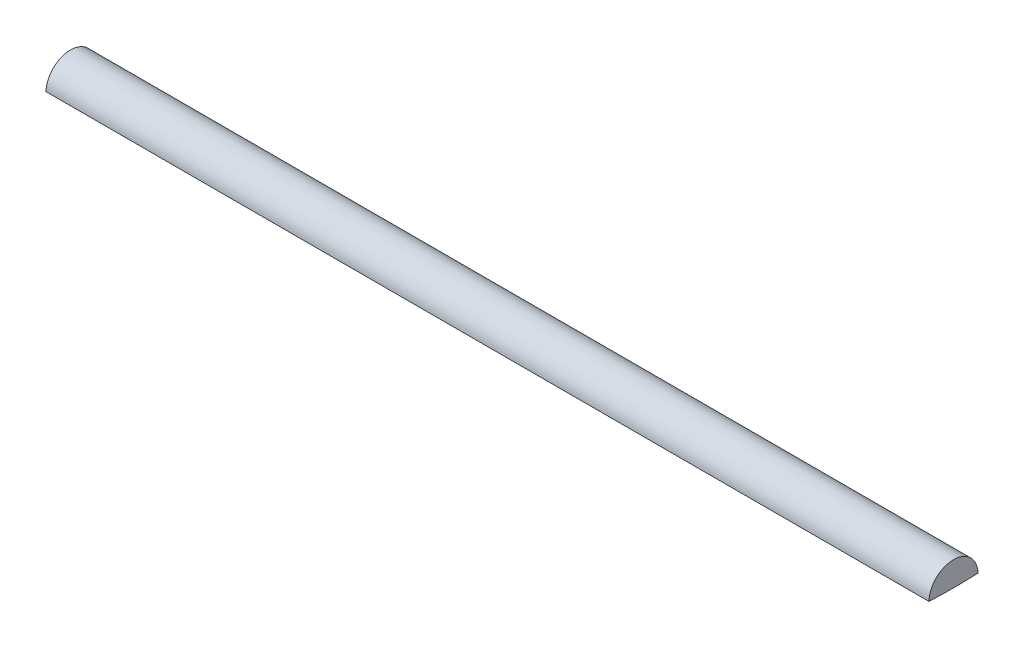
ISO-10303-21;
HEADER;
FILE_DESCRIPTION(('STEP AP214'),'2;1');
FILE_NAME('part.step','',(''),(''),'','','');
FILE_SCHEMA(('AUTOMOTIVE_DESIGN { 1 0 10303 214 1 1 1 1 }'));
ENDSEC;
DATA;
#1=APPLICATION_CONTEXT('core data for automotive mechanical design processes');
#2=APPLICATION_PROTOCOL_DEFINITION('international standard','automotive_design',2000,#1);
#3=PRODUCT_CONTEXT('',#1,'mechanical');
#4=PRODUCT('Part','Part','',(#3));
#5=PRODUCT_RELATED_PRODUCT_CATEGORY('part','',(#4));
#6=PRODUCT_DEFINITION_FORMATION('','',#4);
#7=PRODUCT_DEFINITION_CONTEXT('part definition',#1,'design');
#8=PRODUCT_DEFINITION('design','',#6,#7);
#9=PRODUCT_DEFINITION_SHAPE('','',#8);
#10=(LENGTH_UNIT() NAMED_UNIT(*) SI_UNIT(.MILLI.,.METRE.));
#11=(NAMED_UNIT(*) PLANE_ANGLE_UNIT() SI_UNIT($,.RADIAN.));
#12=(NAMED_UNIT(*) SI_UNIT($,.STERADIAN.) SOLID_ANGLE_UNIT());
#13=UNCERTAINTY_MEASURE_WITH_UNIT(LENGTH_MEASURE(1.E-05),#10,'distance_accuracy_value','');
#14=(GEOMETRIC_REPRESENTATION_CONTEXT(3) GLOBAL_UNCERTAINTY_ASSIGNED_CONTEXT((#13)) GLOBAL_UNIT_ASSIGNED_CONTEXT((#10,
#11,#12)) REPRESENTATION_CONTEXT('',''));
#15=CARTESIAN_POINT('',(0.,0.,0.));
#16=DIRECTION('',(0.,0.,1.));
#17=DIRECTION('',(1.,0.,0.));
#18=AXIS2_PLACEMENT_3D('',#15,#16,#17);
#19=CARTESIAN_POINT('',(114.3,-63.5,0.));
#20=DIRECTION('',(-1.,0.,0.));
#21=DIRECTION('',(0.,0.,1.));
#22=AXIS2_PLACEMENT_3D('',#19,#20,#21);
#23=CYLINDRICAL_SURFACE('',#22,3.17500000000022);
#24=CARTESIAN_POINT('',(0.,-63.5,0.));
#25=DIRECTION('',(1.,0.,0.));
#26=DIRECTION('',(0.,0.,-1.));
#27=AXIS2_PLACEMENT_3D('',#24,#25,#26);
#28=CIRCLE('',#27,3.17500000000022);
#29=CARTESIAN_POINT('',(0.,-63.420625,-3.17400765742244));
#30=VERTEX_POINT('',#29);
#31=CARTESIAN_POINT('',(0.,-63.420625,3.17400765742246));
#32=VERTEX_POINT('',#31);
#33=EDGE_CURVE('E69',#30,#32,#28,.T.);
#34=ORIENTED_EDGE('',*,*,#33,.T.);
#35=DIRECTION('',(-1.,0.,0.));
#36=VECTOR('',#35,1.);
#37=CARTESIAN_POINT('',(114.3,-63.420625,3.17400765742246));
#38=LINE('',#37,#36);
#39=CARTESIAN_POINT('',(114.3,-63.420625,3.17400765742246));
#40=VERTEX_POINT('',#39);
#41=EDGE_CURVE('E11',#40,#32,#38,.T.);
#42=ORIENTED_EDGE('',*,*,#41,.F.);
#43=CARTESIAN_POINT('',(114.3,-63.5,0.));
#44=DIRECTION('',(1.,0.,0.));
#45=DIRECTION('',(0.,0.,-1.));
#46=AXIS2_PLACEMENT_3D('',#43,#44,#45);
#47=CIRCLE('',#46,3.17500000000022);
#48=CARTESIAN_POINT('',(114.3,-63.420625,-3.17400765742244));
#49=VERTEX_POINT('',#48);
#50=EDGE_CURVE('E67',#49,#40,#47,.T.);
#51=ORIENTED_EDGE('',*,*,#50,.F.);
#52=DIRECTION('',(-1.,0.,0.));
#53=VECTOR('',#52,1.);
#54=CARTESIAN_POINT('',(114.3,-63.420625,-3.17400765742244));
#55=LINE('',#54,#53);
#56=EDGE_CURVE('E50',#49,#30,#55,.T.);
#57=ORIENTED_EDGE('',*,*,#56,.T.);
#58=EDGE_LOOP('',(#34,#42,#51,#57));
#59=FACE_BOUND('',#58,.T.);
#60=ADVANCED_FACE('F39',(#59),#23,.T.);
#61=CARTESIAN_POINT('',(114.3,0.,0.));
#62=DIRECTION('',(-1.,0.,0.));
#63=DIRECTION('',(0.,0.,1.));
#64=AXIS2_PLACEMENT_3D('',#61,#62,#63);
#65=CYLINDRICAL_SURFACE('',#64,63.5);
#66=CARTESIAN_POINT('',(0.,0.,0.));
#67=DIRECTION('',(1.,0.,0.));
#68=DIRECTION('',(0.,0.,-1.));
#69=AXIS2_PLACEMENT_3D('',#66,#67,#68);
#70=CIRCLE('',#69,63.5);
#71=EDGE_CURVE('E64',#32,#30,#70,.T.);
#72=ORIENTED_EDGE('',*,*,#71,.T.);
#73=ORIENTED_EDGE('',*,*,#56,.F.);
#74=CARTESIAN_POINT('',(114.3,0.,0.));
#75=DIRECTION('',(1.,0.,0.));
#76=DIRECTION('',(0.,0.,-1.));
#77=AXIS2_PLACEMENT_3D('',#74,#75,#76);
#78=CIRCLE('',#77,63.5);
#79=EDGE_CURVE('E53',#40,#49,#78,.T.);
#80=ORIENTED_EDGE('',*,*,#79,.F.);
#81=ORIENTED_EDGE('',*,*,#41,.T.);
#82=EDGE_LOOP('',(#72,#73,#80,#81));
#83=FACE_BOUND('',#82,.T.);
#84=ADVANCED_FACE('F63',(#83),#65,.T.);
#85=CARTESIAN_POINT('',(114.3,-31.75,0.));
#86=DIRECTION('',(1.,0.,0.));
#87=DIRECTION('',(0.,0.,-1.));
#88=AXIS2_PLACEMENT_3D('',#85,#86,#87);
#89=PLANE('',#88);
#90=ORIENTED_EDGE('',*,*,#50,.T.);
#91=ORIENTED_EDGE('',*,*,#79,.T.);
#92=EDGE_LOOP('',(#90,#91));
#93=FACE_BOUND('',#92,.T.);
#94=ADVANCED_FACE('F79',(#93),#89,.T.);
#95=CARTESIAN_POINT('',(0.,-31.75,0.));
#96=DIRECTION('',(1.,0.,0.));
#97=DIRECTION('',(0.,0.,-1.));
#98=AXIS2_PLACEMENT_3D('',#95,#96,#97);
#99=PLANE('',#98);
#100=ORIENTED_EDGE('',*,*,#33,.F.);
#101=ORIENTED_EDGE('',*,*,#71,.F.);
#102=EDGE_LOOP('',(#100,#101));
#103=FACE_BOUND('',#102,.T.);
#104=ADVANCED_FACE('F71',(#103),#99,.F.);
#105=CLOSED_SHELL('',(#60,#84,#94,#104));
#106=MANIFOLD_SOLID_BREP('B2',#105);
#107=ADVANCED_BREP_SHAPE_REPRESENTATION('',(#18,#106),#14);
#108=SHAPE_DEFINITION_REPRESENTATION(#9,#107);
ENDSEC;
END-ISO-10303-21;
